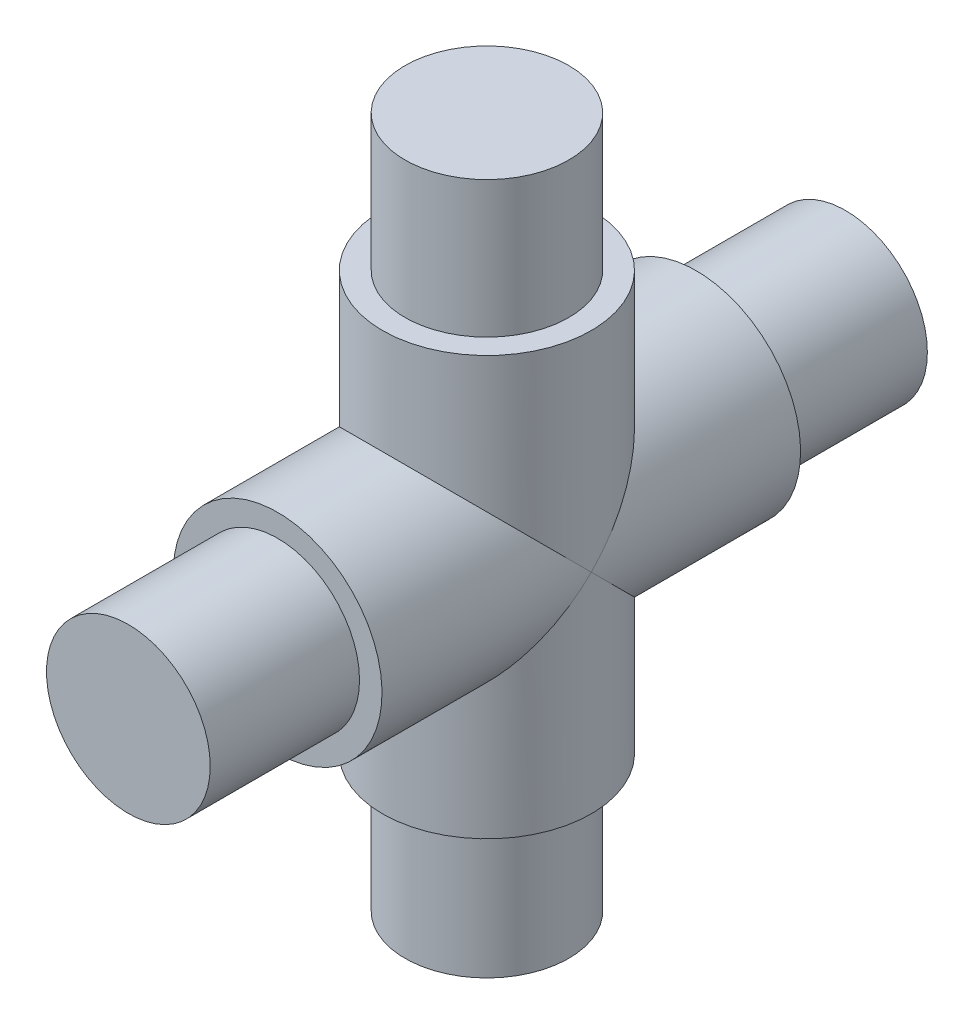
ISO-10303-21;
HEADER;
FILE_DESCRIPTION(('STEP AP214'),'2;1');
FILE_NAME('part.step','',(''),(''),'','','');
FILE_SCHEMA(('AUTOMOTIVE_DESIGN { 1 0 10303 214 1 1 1 1 }'));
ENDSEC;
DATA;
#1=APPLICATION_CONTEXT('core data for automotive mechanical design processes');
#2=APPLICATION_PROTOCOL_DEFINITION('international standard','automotive_design',2000,#1);
#3=PRODUCT_CONTEXT('',#1,'mechanical');
#4=PRODUCT('Part','Part','',(#3));
#5=PRODUCT_RELATED_PRODUCT_CATEGORY('part','',(#4));
#6=PRODUCT_DEFINITION_FORMATION('','',#4);
#7=PRODUCT_DEFINITION_CONTEXT('part definition',#1,'design');
#8=PRODUCT_DEFINITION('design','',#6,#7);
#9=PRODUCT_DEFINITION_SHAPE('','',#8);
#10=(LENGTH_UNIT() NAMED_UNIT(*) SI_UNIT(.MILLI.,.METRE.));
#11=(NAMED_UNIT(*) PLANE_ANGLE_UNIT() SI_UNIT($,.RADIAN.));
#12=(NAMED_UNIT(*) SI_UNIT($,.STERADIAN.) SOLID_ANGLE_UNIT());
#13=UNCERTAINTY_MEASURE_WITH_UNIT(LENGTH_MEASURE(1.E-05),#10,'distance_accuracy_value','');
#14=(GEOMETRIC_REPRESENTATION_CONTEXT(3) GLOBAL_UNCERTAINTY_ASSIGNED_CONTEXT((#13)) GLOBAL_UNIT_ASSIGNED_CONTEXT((#10,
#11,#12)) REPRESENTATION_CONTEXT('',''));
#15=CARTESIAN_POINT('',(0.,0.,0.));
#16=DIRECTION('',(0.,0.,1.));
#17=DIRECTION('',(1.,0.,0.));
#18=AXIS2_PLACEMENT_3D('',#15,#16,#17);
#19=CARTESIAN_POINT('',(35.0406980185025,227.816189466876,-47.5926924561766));
#20=DIRECTION('',(0.,0.,1.));
#21=DIRECTION('',(0.,-1.,0.));
#22=AXIS2_PLACEMENT_3D('',#19,#20,#21);
#23=PLANE('',#22);
#24=CARTESIAN_POINT('',(35.0406980185025,227.816189466876,-47.5926924561766));
#25=DIRECTION('',(0.,0.,1.));
#26=DIRECTION('',(1.,0.,0.));
#27=AXIS2_PLACEMENT_3D('',#24,#25,#26);
#28=CIRCLE('',#27,10.8668426453202);
#29=CARTESIAN_POINT('',(45.9075406638227,227.816189466876,-47.5926924561766));
#30=VERTEX_POINT('',#29);
#31=EDGE_CURVE('E19',#30,#30,#28,.T.);
#32=ORIENTED_EDGE('',*,*,#31,.F.);
#33=EDGE_LOOP('',(#32));
#34=FACE_BOUND('',#33,.T.);
#35=ADVANCED_FACE('F16',(#34),#23,.F.);
#36=CARTESIAN_POINT('',(35.0406980185029,181.93014245378,1.08286712929839E-12));
#37=DIRECTION('',(0.,-1.,0.));
#38=DIRECTION('',(0.,0.,-1.));
#39=AXIS2_PLACEMENT_3D('',#36,#37,#38);
#40=PLANE('',#39);
#41=CARTESIAN_POINT('',(35.0406980185026,181.93014245378,7.70030987254141E-13));
#42=DIRECTION('',(0.,-1.,0.));
#43=DIRECTION('',(0.,0.,-1.));
#44=AXIS2_PLACEMENT_3D('',#41,#42,#43);
#45=CIRCLE('',#44,10.8668426453202);
#46=CARTESIAN_POINT('',(35.0406980185026,181.93014245378,-10.8668426453194));
#47=VERTEX_POINT('',#46);
#48=EDGE_CURVE('E118',#47,#47,#45,.F.);
#49=ORIENTED_EDGE('',*,*,#48,.F.);
#50=EDGE_LOOP('',(#49));
#51=FACE_BOUND('',#50,.T.);
#52=ADVANCED_FACE('F108',(#51),#40,.T.);
#53=CARTESIAN_POINT('',(35.0406980185025,227.816189466876,-47.5926924561766));
#54=DIRECTION('',(0.,0.,1.));
#55=DIRECTION('',(1.,0.,0.));
#56=AXIS2_PLACEMENT_3D('',#53,#54,#55);
#57=CYLINDRICAL_SURFACE('',#56,10.8668426453202);
#58=ORIENTED_EDGE('',*,*,#31,.T.);
#59=EDGE_LOOP('',(#58));
#60=FACE_BOUND('',#59,.T.);
#61=CARTESIAN_POINT('',(35.0406980185026,227.816189466876,-27.7774449200171));
#62=DIRECTION('',(0.,0.,1.));
#63=DIRECTION('',(1.,0.,0.));
#64=AXIS2_PLACEMENT_3D('',#61,#62,#63);
#65=CIRCLE('',#64,10.8668426453202);
#66=CARTESIAN_POINT('',(45.9075406638228,227.816189466876,-27.7774449200171));
#67=VERTEX_POINT('',#66);
#68=EDGE_CURVE('E40',#67,#67,#65,.T.);
#69=ORIENTED_EDGE('',*,*,#68,.F.);
#70=EDGE_LOOP('',(#69));
#71=FACE_BOUND('',#70,.T.);
#72=ADVANCED_FACE('F105',(#60,#71),#57,.T.);
#73=CARTESIAN_POINT('',(35.0406980185027,275.408881923054,9.9262820185686E-13));
#74=DIRECTION('',(0.,-1.,0.));
#75=DIRECTION('',(0.,0.,-1.));
#76=AXIS2_PLACEMENT_3D('',#73,#74,#75);
#77=CYLINDRICAL_SURFACE('',#76,10.8668426453202);
#78=CARTESIAN_POINT('',(35.0406980185026,200.038744546858,8.13152283167562E-13));
#79=DIRECTION('',(0.,-1.,0.));
#80=DIRECTION('',(0.,0.,-1.));
#81=AXIS2_PLACEMENT_3D('',#78,#79,#80);
#82=CIRCLE('',#81,10.8668426453202);
#83=CARTESIAN_POINT('',(35.0406980185026,200.038744546858,-10.8668426453194));
#84=VERTEX_POINT('',#83);
#85=EDGE_CURVE('E39',#84,#84,#82,.T.);
#86=ORIENTED_EDGE('',*,*,#85,.T.);
#87=EDGE_LOOP('',(#86));
#88=FACE_BOUND('',#87,.T.);
#89=ORIENTED_EDGE('',*,*,#48,.T.);
#90=EDGE_LOOP('',(#89));
#91=FACE_BOUND('',#90,.T.);
#92=ADVANCED_FACE('F101',(#88,#91),#77,.T.);
#93=CARTESIAN_POINT('',(35.0406980185027,273.702236479972,1.03774766557763E-12));
#94=DIRECTION('',(0.,1.,0.));
#95=DIRECTION('',(0.,0.,1.));
#96=AXIS2_PLACEMENT_3D('',#93,#94,#95);
#97=PLANE('',#96);
#98=CARTESIAN_POINT('',(35.0406980185027,273.702236479972,9.88564234754808E-13));
#99=DIRECTION('',(0.,-1.,0.));
#100=DIRECTION('',(0.,0.,-1.));
#101=AXIS2_PLACEMENT_3D('',#98,#99,#100);
#102=CIRCLE('',#101,10.8668426453202);
#103=CARTESIAN_POINT('',(35.0406980185027,273.702236479972,-10.8668426453192));
#104=VERTEX_POINT('',#103);
#105=EDGE_CURVE('E126',#104,#104,#102,.T.);
#106=ORIENTED_EDGE('',*,*,#105,.F.);
#107=EDGE_LOOP('',(#106));
#108=FACE_BOUND('',#107,.T.);
#109=ADVANCED_FACE('F97',(#108),#97,.T.);
#110=CARTESIAN_POINT('',(35.0406980185025,227.816189466876,-27.7774449200171));
#111=DIRECTION('',(0.,0.,-1.));
#112=DIRECTION('',(0.,1.,0.));
#113=AXIS2_PLACEMENT_3D('',#110,#111,#112);
#114=PLANE('',#113);
#115=CARTESIAN_POINT('',(35.0406980185025,227.816189466876,-27.7774449200171));
#116=DIRECTION('',(0.,0.,1.));
#117=DIRECTION('',(0.,-1.,0.));
#118=AXIS2_PLACEMENT_3D('',#115,#116,#117);
#119=CIRCLE('',#118,13.8544307562884);
#120=CARTESIAN_POINT('',(35.0406980185025,213.961758710588,-27.7774449200171));
#121=VERTEX_POINT('',#120);
#122=EDGE_CURVE('E129',#121,#121,#119,.T.);
#123=ORIENTED_EDGE('',*,*,#122,.F.);
#124=EDGE_LOOP('',(#123));
#125=FACE_BOUND('',#124,.T.);
#126=ORIENTED_EDGE('',*,*,#68,.T.);
#127=EDGE_LOOP('',(#126));
#128=FACE_BOUND('',#127,.T.);
#129=ADVANCED_FACE('F93',(#125,#128),#114,.T.);
#130=CARTESIAN_POINT('',(35.0406980185029,227.816189466876,47.5926924561783));
#131=DIRECTION('',(0.,0.,1.));
#132=DIRECTION('',(0.,-1.,0.));
#133=AXIS2_PLACEMENT_3D('',#130,#131,#132);
#134=PLANE('',#133);
#135=CARTESIAN_POINT('',(35.0406980185028,227.816189466876,47.5926924561783));
#136=DIRECTION('',(0.,0.,1.));
#137=DIRECTION('',(1.,0.,0.));
#138=AXIS2_PLACEMENT_3D('',#135,#136,#137);
#139=CIRCLE('',#138,10.8668426453202);
#140=CARTESIAN_POINT('',(45.907540663823,227.816189466876,47.5926924561782));
#141=VERTEX_POINT('',#140);
#142=EDGE_CURVE('E132',#141,#141,#139,.F.);
#143=ORIENTED_EDGE('',*,*,#142,.F.);
#144=EDGE_LOOP('',(#143));
#145=FACE_BOUND('',#144,.T.);
#146=ADVANCED_FACE('F89',(#145),#134,.T.);
#147=CARTESIAN_POINT('',(35.0406980185025,200.038744546858,6.76791955811495E-13));
#148=DIRECTION('',(0.,1.,0.));
#149=DIRECTION('',(0.,0.,1.));
#150=AXIS2_PLACEMENT_3D('',#147,#148,#149);
#151=PLANE('',#150);
#152=CARTESIAN_POINT('',(35.0406980185025,200.038744546858,6.76791955811495E-13));
#153=DIRECTION('',(0.,1.,0.));
#154=DIRECTION('',(0.,0.,1.));
#155=AXIS2_PLACEMENT_3D('',#152,#153,#154);
#156=CIRCLE('',#155,13.8544307562884);
#157=CARTESIAN_POINT('',(35.0406980185025,200.038744546858,13.8544307562891));
#158=VERTEX_POINT('',#157);
#159=EDGE_CURVE('E135',#158,#158,#156,.T.);
#160=ORIENTED_EDGE('',*,*,#159,.F.);
#161=EDGE_LOOP('',(#160));
#162=FACE_BOUND('',#161,.T.);
#163=ORIENTED_EDGE('',*,*,#85,.F.);
#164=EDGE_LOOP('',(#163));
#165=FACE_BOUND('',#164,.T.);
#166=ADVANCED_FACE('F85',(#162,#165),#151,.F.);
#167=CARTESIAN_POINT('',(35.0406980185027,275.408881923054,9.9262820185686E-13));
#168=DIRECTION('',(0.,-1.,0.));
#169=DIRECTION('',(0.,0.,-1.));
#170=AXIS2_PLACEMENT_3D('',#167,#168,#169);
#171=CYLINDRICAL_SURFACE('',#170,10.8668426453202);
#172=ORIENTED_EDGE('',*,*,#105,.T.);
#173=EDGE_LOOP('',(#172));
#174=FACE_BOUND('',#173,.T.);
#175=CARTESIAN_POINT('',(35.0406980185027,255.593634386894,9.45442938841387E-13));
#176=DIRECTION('',(0.,-1.,0.));
#177=DIRECTION('',(0.,0.,-1.));
#178=AXIS2_PLACEMENT_3D('',#175,#176,#177);
#179=CIRCLE('',#178,10.8668426453202);
#180=CARTESIAN_POINT('',(35.0406980185027,255.593634386894,-10.8668426453193));
#181=VERTEX_POINT('',#180);
#182=EDGE_CURVE('E52',#181,#181,#179,.T.);
#183=ORIENTED_EDGE('',*,*,#182,.F.);
#184=EDGE_LOOP('',(#183));
#185=FACE_BOUND('',#184,.T.);
#186=ADVANCED_FACE('F82',(#174,#185),#171,.T.);
#187=CARTESIAN_POINT('',(35.0406980185025,227.816189466876,-27.7774449200171));
#188=DIRECTION('',(0.,0.,1.));
#189=DIRECTION('',(0.,-1.,0.));
#190=AXIS2_PLACEMENT_3D('',#187,#188,#189);
#191=CYLINDRICAL_SURFACE('',#190,13.8544307562884);
#192=CARTESIAN_POINT('',(35.0406980185025,227.816189466876,7.38731237204268E-13));
#193=DIRECTION('',(0.,0.707106781186549,-0.707106781186546));
#194=DIRECTION('',(0.,0.707106781186546,0.707106781186549));
#195=AXIS2_PLACEMENT_3D('',#192,#193,#194);
#196=ELLIPSE('',#195,19.593123874502,13.8544307562884);
#197=CARTESIAN_POINT('',(21.1862672622141,227.816189466876,7.54383065622909E-13));
#198=VERTEX_POINT('',#197);
#199=CARTESIAN_POINT('',(48.8951287747909,227.816189466876,6.99819294878123E-13));
#200=VERTEX_POINT('',#199);
#201=EDGE_CURVE('E31',#198,#200,#196,.F.);
#202=ORIENTED_EDGE('',*,*,#201,.F.);
#203=CARTESIAN_POINT('',(35.0406980185025,227.816189466876,7.38731237204268E-13));
#204=DIRECTION('',(0.,0.707106781186546,0.707106781186549));
#205=DIRECTION('',(0.,0.707106781186549,-0.707106781186546));
#206=AXIS2_PLACEMENT_3D('',#203,#204,#205);
#207=ELLIPSE('',#206,19.593123874502,13.8544307562884);
#208=EDGE_CURVE('E37',#200,#198,#207,.T.);
#209=ORIENTED_EDGE('',*,*,#208,.F.);
#210=EDGE_LOOP('',(#202,#209));
#211=FACE_BOUND('',#210,.T.);
#212=ORIENTED_EDGE('',*,*,#122,.T.);
#213=EDGE_LOOP('',(#212));
#214=FACE_BOUND('',#213,.T.);
#215=ADVANCED_FACE('F34',(#211,#214),#191,.T.);
#216=CARTESIAN_POINT('',(35.0406980185025,227.816189466876,-47.5926924561766));
#217=DIRECTION('',(0.,0.,1.));
#218=DIRECTION('',(1.,0.,0.));
#219=AXIS2_PLACEMENT_3D('',#216,#217,#218);
#220=CYLINDRICAL_SURFACE('',#219,10.8668426453202);
#221=CARTESIAN_POINT('',(35.0406980185027,227.816189466876,27.7774449200188));
#222=DIRECTION('',(0.,0.,1.));
#223=DIRECTION('',(1.,0.,0.));
#224=AXIS2_PLACEMENT_3D('',#221,#222,#223);
#225=CIRCLE('',#224,10.8668426453202);
#226=CARTESIAN_POINT('',(45.9075406638229,227.816189466876,27.7774449200188));
#227=VERTEX_POINT('',#226);
#228=EDGE_CURVE('E48',#227,#227,#225,.T.);
#229=ORIENTED_EDGE('',*,*,#228,.T.);
#230=EDGE_LOOP('',(#229));
#231=FACE_BOUND('',#230,.T.);
#232=ORIENTED_EDGE('',*,*,#142,.T.);
#233=EDGE_LOOP('',(#232));
#234=FACE_BOUND('',#233,.T.);
#235=ADVANCED_FACE('F76',(#231,#234),#220,.T.);
#236=CARTESIAN_POINT('',(35.0406980185025,200.038744546858,6.76791955811495E-13));
#237=DIRECTION('',(0.,1.,0.));
#238=DIRECTION('',(0.,0.,1.));
#239=AXIS2_PLACEMENT_3D('',#236,#237,#238);
#240=CYLINDRICAL_SURFACE('',#239,13.8544307562884);
#241=ORIENTED_EDGE('',*,*,#201,.T.);
#242=CARTESIAN_POINT('',(35.0406980185025,227.816189466876,7.36996513728291E-13));
#243=DIRECTION('',(0.,0.707106781186546,0.707106781186549));
#244=DIRECTION('',(0.,-0.707106781186549,0.707106781186546));
#245=AXIS2_PLACEMENT_3D('',#242,#243,#244);
#246=ELLIPSE('',#245,19.593123874502,13.8544307562884);
#247=EDGE_CURVE('E42',#198,#200,#246,.T.);
#248=ORIENTED_EDGE('',*,*,#247,.F.);
#249=EDGE_LOOP('',(#241,#248));
#250=FACE_BOUND('',#249,.T.);
#251=ORIENTED_EDGE('',*,*,#159,.T.);
#252=EDGE_LOOP('',(#251));
#253=FACE_BOUND('',#252,.T.);
#254=ADVANCED_FACE('F43',(#250,#253),#240,.T.);
#255=CARTESIAN_POINT('',(35.0406980185027,255.593634386894,8.12150346973794E-13));
#256=DIRECTION('',(0.,1.,0.));
#257=DIRECTION('',(0.,0.,1.));
#258=AXIS2_PLACEMENT_3D('',#255,#256,#257);
#259=PLANE('',#258);
#260=CARTESIAN_POINT('',(35.0406980185026,255.593634386894,8.00148591473337E-13));
#261=DIRECTION('',(0.,1.,0.));
#262=DIRECTION('',(0.,0.,1.));
#263=AXIS2_PLACEMENT_3D('',#260,#261,#262);
#264=CIRCLE('',#263,13.8544307562884);
#265=CARTESIAN_POINT('',(35.0406980185026,255.593634386894,13.8544307562892));
#266=VERTEX_POINT('',#265);
#267=EDGE_CURVE('E47',#266,#266,#264,.F.);
#268=ORIENTED_EDGE('',*,*,#267,.F.);
#269=EDGE_LOOP('',(#268));
#270=FACE_BOUND('',#269,.T.);
#271=ORIENTED_EDGE('',*,*,#182,.T.);
#272=EDGE_LOOP('',(#271));
#273=FACE_BOUND('',#272,.T.);
#274=ADVANCED_FACE('F69',(#270,#273),#259,.T.);
#275=CARTESIAN_POINT('',(35.0406980185027,227.816189466876,27.7774449200189));
#276=DIRECTION('',(0.,0.,-1.));
#277=DIRECTION('',(0.,1.,0.));
#278=AXIS2_PLACEMENT_3D('',#275,#276,#277);
#279=PLANE('',#278);
#280=CARTESIAN_POINT('',(35.0406980185026,227.816189466876,27.7774449200188));
#281=DIRECTION('',(0.,0.,1.));
#282=DIRECTION('',(0.,-1.,0.));
#283=AXIS2_PLACEMENT_3D('',#280,#281,#282);
#284=CIRCLE('',#283,13.8544307562884);
#285=CARTESIAN_POINT('',(35.0406980185026,213.961758710588,27.7774449200188));
#286=VERTEX_POINT('',#285);
#287=EDGE_CURVE('E24',#286,#286,#284,.F.);
#288=ORIENTED_EDGE('',*,*,#287,.F.);
#289=EDGE_LOOP('',(#288));
#290=FACE_BOUND('',#289,.T.);
#291=ORIENTED_EDGE('',*,*,#228,.F.);
#292=EDGE_LOOP('',(#291));
#293=FACE_BOUND('',#292,.T.);
#294=ADVANCED_FACE('F62',(#290,#293),#279,.F.);
#295=CARTESIAN_POINT('',(35.0406980185025,200.038744546858,6.76791955811495E-13));
#296=DIRECTION('',(0.,1.,0.));
#297=DIRECTION('',(0.,0.,1.));
#298=AXIS2_PLACEMENT_3D('',#295,#296,#297);
#299=CYLINDRICAL_SURFACE('',#298,13.8544307562884);
#300=ORIENTED_EDGE('',*,*,#267,.T.);
#301=EDGE_LOOP('',(#300));
#302=FACE_BOUND('',#301,.T.);
#303=CARTESIAN_POINT('',(35.0406980185025,227.816189466876,7.36996513728291E-13));
#304=DIRECTION('',(0.,-0.707106781186549,0.707106781186546));
#305=DIRECTION('',(0.,0.707106781186546,0.707106781186549));
#306=AXIS2_PLACEMENT_3D('',#303,#304,#305);
#307=ELLIPSE('',#306,19.593123874502,13.8544307562884);
#308=EDGE_CURVE('E10',#200,#198,#307,.T.);
#309=ORIENTED_EDGE('',*,*,#308,.F.);
#310=ORIENTED_EDGE('',*,*,#208,.T.);
#311=EDGE_LOOP('',(#309,#310));
#312=FACE_BOUND('',#311,.T.);
#313=ADVANCED_FACE('F51',(#302,#312),#299,.T.);
#314=CARTESIAN_POINT('',(35.0406980185025,227.816189466876,-27.7774449200171));
#315=DIRECTION('',(0.,0.,1.));
#316=DIRECTION('',(0.,-1.,0.));
#317=AXIS2_PLACEMENT_3D('',#314,#315,#316);
#318=CYLINDRICAL_SURFACE('',#317,13.8544307562884);
#319=ORIENTED_EDGE('',*,*,#287,.T.);
#320=EDGE_LOOP('',(#319));
#321=FACE_BOUND('',#320,.T.);
#322=ORIENTED_EDGE('',*,*,#308,.T.);
#323=ORIENTED_EDGE('',*,*,#247,.T.);
#324=EDGE_LOOP('',(#322,#323));
#325=FACE_BOUND('',#324,.T.);
#326=ADVANCED_FACE('F54',(#321,#325),#318,.T.);
#327=CLOSED_SHELL('',(#35,#52,#72,#92,#109,#129,#146,#166,#186,#215,#235,#254,#274,#294,#313,#326));
#328=MANIFOLD_SOLID_BREP('B1',#327);
#329=ADVANCED_BREP_SHAPE_REPRESENTATION('',(#18,#328),#14);
#330=SHAPE_DEFINITION_REPRESENTATION(#9,#329);
ENDSEC;
END-ISO-10303-21;
